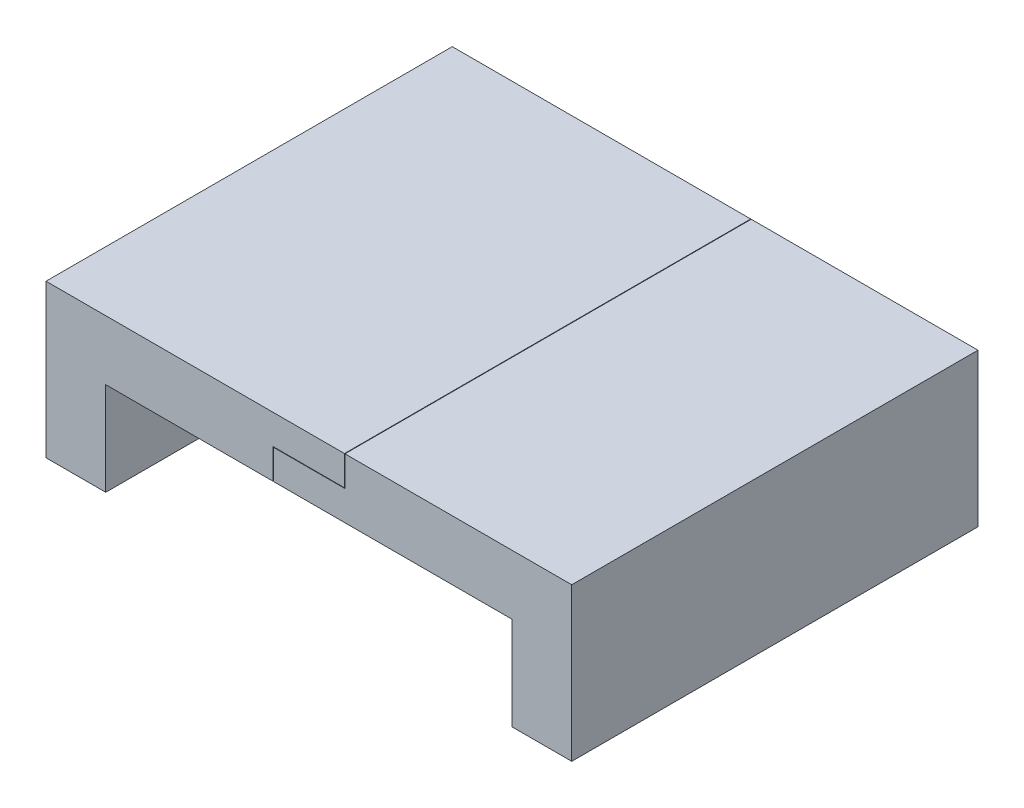
ISO-10303-21;
HEADER;
FILE_DESCRIPTION(('STEP AP214'),'2;1');
FILE_NAME('part.step','',(''),(''),'','','');
FILE_SCHEMA(('AUTOMOTIVE_DESIGN { 1 0 10303 214 1 1 1 1 }'));
ENDSEC;
DATA;
#1=APPLICATION_CONTEXT('core data for automotive mechanical design processes');
#2=APPLICATION_PROTOCOL_DEFINITION('international standard','automotive_design',2000,#1);
#3=PRODUCT_CONTEXT('',#1,'mechanical');
#4=PRODUCT('Part','Part','',(#3));
#5=PRODUCT_RELATED_PRODUCT_CATEGORY('part','',(#4));
#6=PRODUCT_DEFINITION_FORMATION('','',#4);
#7=PRODUCT_DEFINITION_CONTEXT('part definition',#1,'design');
#8=PRODUCT_DEFINITION('design','',#6,#7);
#9=PRODUCT_DEFINITION_SHAPE('','',#8);
#10=(LENGTH_UNIT() NAMED_UNIT(*) SI_UNIT(.MILLI.,.METRE.));
#11=(NAMED_UNIT(*) PLANE_ANGLE_UNIT() SI_UNIT($,.RADIAN.));
#12=(NAMED_UNIT(*) SI_UNIT($,.STERADIAN.) SOLID_ANGLE_UNIT());
#13=UNCERTAINTY_MEASURE_WITH_UNIT(LENGTH_MEASURE(1.E-05),#10,'distance_accuracy_value','');
#14=(GEOMETRIC_REPRESENTATION_CONTEXT(3) GLOBAL_UNCERTAINTY_ASSIGNED_CONTEXT((#13)) GLOBAL_UNIT_ASSIGNED_CONTEXT((#10,
#11,#12)) REPRESENTATION_CONTEXT('',''));
#15=CARTESIAN_POINT('',(0.,0.,0.));
#16=DIRECTION('',(0.,0.,1.));
#17=DIRECTION('',(1.,0.,0.));
#18=AXIS2_PLACEMENT_3D('',#15,#16,#17);
#19=CARTESIAN_POINT('',(0.,0.,0.));
#20=DIRECTION('',(0.,1.,0.));
#21=DIRECTION('',(0.,0.,1.));
#22=AXIS2_PLACEMENT_3D('',#19,#20,#21);
#23=PLANE('',#22);
#24=DIRECTION('',(-1.,0.,0.));
#25=VECTOR('',#24,1.);
#26=CARTESIAN_POINT('',(-139.7,0.,-107.95));
#27=LINE('',#26,#25);
#28=CARTESIAN_POINT('',(-19.177,0.,-107.95));
#29=VERTEX_POINT('',#28);
#30=CARTESIAN_POINT('',(-107.95,0.,-107.95));
#31=VERTEX_POINT('',#30);
#32=EDGE_CURVE('E156',#29,#31,#27,.T.);
#33=ORIENTED_EDGE('',*,*,#32,.F.);
#34=DIRECTION('',(0.,0.,1.));
#35=VECTOR('',#34,1.);
#36=CARTESIAN_POINT('',(-19.177,0.,-107.950012));
#37=LINE('',#36,#35);
#38=CARTESIAN_POINT('',(-19.177,0.,107.95));
#39=VERTEX_POINT('',#38);
#40=EDGE_CURVE('E219',#29,#39,#37,.T.);
#41=ORIENTED_EDGE('',*,*,#40,.T.);
#42=DIRECTION('',(1.,0.,0.));
#43=VECTOR('',#42,1.);
#44=CARTESIAN_POINT('',(-139.7,0.,107.95));
#45=LINE('',#44,#43);
#46=CARTESIAN_POINT('',(-107.95,0.,107.95));
#47=VERTEX_POINT('',#46);
#48=EDGE_CURVE('E138',#47,#39,#45,.T.);
#49=ORIENTED_EDGE('',*,*,#48,.F.);
#50=DIRECTION('',(0.,0.,1.));
#51=VECTOR('',#50,1.);
#52=CARTESIAN_POINT('',(-107.95,0.,-166.782672895254));
#53=LINE('',#52,#51);
#54=EDGE_CURVE('E150',#31,#47,#53,.T.);
#55=ORIENTED_EDGE('',*,*,#54,.F.);
#56=EDGE_LOOP('',(#33,#41,#49,#55));
#57=FACE_BOUND('',#56,.T.);
#58=ADVANCED_FACE('F51',(#57),#23,.F.);
#59=CARTESIAN_POINT('',(-139.7,31.75,-107.95));
#60=DIRECTION('',(0.,0.,1.));
#61=DIRECTION('',(1.,0.,0.));
#62=AXIS2_PLACEMENT_3D('',#59,#60,#61);
#63=PLANE('',#62);
#64=DIRECTION('',(-1.,0.,0.));
#65=VECTOR('',#64,1.);
#66=CARTESIAN_POINT('',(-139.7,16.002,-107.95));
#67=LINE('',#66,#65);
#68=CARTESIAN_POINT('',(18.923,16.002,-107.95));
#69=VERTEX_POINT('',#68);
#70=CARTESIAN_POINT('',(-19.177,16.002,-107.95));
#71=VERTEX_POINT('',#70);
#72=EDGE_CURVE('E216',#69,#71,#67,.T.);
#73=ORIENTED_EDGE('',*,*,#72,.T.);
#74=DIRECTION('',(0.,-1.,0.));
#75=VECTOR('',#74,1.);
#76=CARTESIAN_POINT('',(-19.177,31.75,-107.95));
#77=LINE('',#76,#75);
#78=EDGE_CURVE('E120',#71,#29,#77,.T.);
#79=ORIENTED_EDGE('',*,*,#78,.T.);
#80=ORIENTED_EDGE('',*,*,#32,.T.);
#81=DIRECTION('',(0.,-1.,0.));
#82=VECTOR('',#81,1.);
#83=CARTESIAN_POINT('',(-107.95,0.,-107.95));
#84=LINE('',#83,#82);
#85=CARTESIAN_POINT('',(-107.95,-49.53,-107.95));
#86=VERTEX_POINT('',#85);
#87=EDGE_CURVE('E159',#31,#86,#84,.T.);
#88=ORIENTED_EDGE('',*,*,#87,.T.);
#89=DIRECTION('',(-1.,0.,0.));
#90=VECTOR('',#89,1.);
#91=CARTESIAN_POINT('',(-139.7,-49.53,-107.95));
#92=LINE('',#91,#90);
#93=CARTESIAN_POINT('',(-139.7,-49.53,-107.95));
#94=VERTEX_POINT('',#93);
#95=EDGE_CURVE('E195',#86,#94,#92,.T.);
#96=ORIENTED_EDGE('',*,*,#95,.T.);
#97=DIRECTION('',(0.,-1.,0.));
#98=VECTOR('',#97,1.);
#99=CARTESIAN_POINT('',(-139.7,31.75,-107.95));
#100=LINE('',#99,#98);
#101=CARTESIAN_POINT('',(-139.7,31.75,-107.95));
#102=VERTEX_POINT('',#101);
#103=EDGE_CURVE('E186',#102,#94,#100,.T.);
#104=ORIENTED_EDGE('',*,*,#103,.F.);
#105=DIRECTION('',(-1.,0.,0.));
#106=VECTOR('',#105,1.);
#107=CARTESIAN_POINT('',(-139.7,31.75,-107.95));
#108=LINE('',#107,#106);
#109=CARTESIAN_POINT('',(18.923,31.75,-107.95));
#110=VERTEX_POINT('',#109);
#111=EDGE_CURVE('E152',#110,#102,#108,.T.);
#112=ORIENTED_EDGE('',*,*,#111,.F.);
#113=DIRECTION('',(0.,-1.,0.));
#114=VECTOR('',#113,1.);
#115=CARTESIAN_POINT('',(18.923,31.75,-107.95));
#116=LINE('',#115,#114);
#117=EDGE_CURVE('E68',#110,#69,#116,.T.);
#118=ORIENTED_EDGE('',*,*,#117,.T.);
#119=EDGE_LOOP('',(#73,#79,#80,#88,#96,#104,#112,#118));
#120=FACE_BOUND('',#119,.T.);
#121=ADVANCED_FACE('F249',(#120),#63,.F.);
#122=CARTESIAN_POINT('',(-139.7,31.75,-107.95));
#123=DIRECTION('',(1.,0.,0.));
#124=DIRECTION('',(0.,0.,-1.));
#125=AXIS2_PLACEMENT_3D('',#122,#123,#124);
#126=PLANE('',#125);
#127=ORIENTED_EDGE('',*,*,#103,.T.);
#128=DIRECTION('',(0.,0.,1.));
#129=VECTOR('',#128,1.);
#130=CARTESIAN_POINT('',(-139.7,-49.53,-166.782672895254));
#131=LINE('',#130,#129);
#132=CARTESIAN_POINT('',(-139.7,-49.53,107.95));
#133=VERTEX_POINT('',#132);
#134=EDGE_CURVE('E142',#94,#133,#131,.T.);
#135=ORIENTED_EDGE('',*,*,#134,.T.);
#136=DIRECTION('',(0.,-1.,0.));
#137=VECTOR('',#136,1.);
#138=CARTESIAN_POINT('',(-139.7,31.75,107.95));
#139=LINE('',#138,#137);
#140=CARTESIAN_POINT('',(-139.7,31.75,107.95));
#141=VERTEX_POINT('',#140);
#142=EDGE_CURVE('E189',#141,#133,#139,.T.);
#143=ORIENTED_EDGE('',*,*,#142,.F.);
#144=DIRECTION('',(0.,0.,1.));
#145=VECTOR('',#144,1.);
#146=CARTESIAN_POINT('',(-139.7,31.75,-107.95));
#147=LINE('',#146,#145);
#148=EDGE_CURVE('E151',#102,#141,#147,.T.);
#149=ORIENTED_EDGE('',*,*,#148,.F.);
#150=EDGE_LOOP('',(#127,#135,#143,#149));
#151=FACE_BOUND('',#150,.T.);
#152=ADVANCED_FACE('F234',(#151),#126,.F.);
#153=CARTESIAN_POINT('',(-139.7,31.75,107.95));
#154=DIRECTION('',(0.,0.,-1.));
#155=DIRECTION('',(-1.,0.,0.));
#156=AXIS2_PLACEMENT_3D('',#153,#154,#155);
#157=PLANE('',#156);
#158=ORIENTED_EDGE('',*,*,#48,.T.);
#159=DIRECTION('',(0.,1.,0.));
#160=VECTOR('',#159,1.);
#161=CARTESIAN_POINT('',(-19.177,15.875,107.95));
#162=LINE('',#161,#160);
#163=CARTESIAN_POINT('',(-19.177,16.002,107.95));
#164=VERTEX_POINT('',#163);
#165=EDGE_CURVE('E117',#39,#164,#162,.T.);
#166=ORIENTED_EDGE('',*,*,#165,.T.);
#167=DIRECTION('',(1.,0.,0.));
#168=VECTOR('',#167,1.);
#169=CARTESIAN_POINT('',(19.05,16.002,107.95));
#170=LINE('',#169,#168);
#171=CARTESIAN_POINT('',(18.923,16.002,107.95));
#172=VERTEX_POINT('',#171);
#173=EDGE_CURVE('E127',#164,#172,#170,.T.);
#174=ORIENTED_EDGE('',*,*,#173,.T.);
#175=DIRECTION('',(0.,1.,0.));
#176=VECTOR('',#175,1.);
#177=CARTESIAN_POINT('',(18.923,31.75,107.95));
#178=LINE('',#177,#176);
#179=CARTESIAN_POINT('',(18.923,31.75,107.95));
#180=VERTEX_POINT('',#179);
#181=EDGE_CURVE('E133',#172,#180,#178,.T.);
#182=ORIENTED_EDGE('',*,*,#181,.T.);
#183=DIRECTION('',(1.,0.,0.));
#184=VECTOR('',#183,1.);
#185=CARTESIAN_POINT('',(-139.7,31.75,107.95));
#186=LINE('',#185,#184);
#187=EDGE_CURVE('E146',#141,#180,#186,.T.);
#188=ORIENTED_EDGE('',*,*,#187,.F.);
#189=ORIENTED_EDGE('',*,*,#142,.T.);
#190=DIRECTION('',(1.,0.,0.));
#191=VECTOR('',#190,1.);
#192=CARTESIAN_POINT('',(-139.7,-49.53,107.95));
#193=LINE('',#192,#191);
#194=CARTESIAN_POINT('',(-107.95,-49.53,107.95));
#195=VERTEX_POINT('',#194);
#196=EDGE_CURVE('E192',#133,#195,#193,.T.);
#197=ORIENTED_EDGE('',*,*,#196,.T.);
#198=DIRECTION('',(0.,1.,0.));
#199=VECTOR('',#198,1.);
#200=CARTESIAN_POINT('',(-107.95,0.,107.95));
#201=LINE('',#200,#199);
#202=EDGE_CURVE('E154',#195,#47,#201,.T.);
#203=ORIENTED_EDGE('',*,*,#202,.T.);
#204=EDGE_LOOP('',(#158,#166,#174,#182,#188,#189,#197,#203));
#205=FACE_BOUND('',#204,.T.);
#206=ADVANCED_FACE('F136',(#205),#157,.F.);
#207=CARTESIAN_POINT('',(0.,31.75,0.));
#208=DIRECTION('',(0.,1.,0.));
#209=DIRECTION('',(0.,0.,1.));
#210=AXIS2_PLACEMENT_3D('',#207,#208,#209);
#211=PLANE('',#210);
#212=DIRECTION('',(0.,0.,1.));
#213=VECTOR('',#212,1.);
#214=CARTESIAN_POINT('',(18.923,31.75,0.));
#215=LINE('',#214,#213);
#216=EDGE_CURVE('E12',#110,#180,#215,.T.);
#217=ORIENTED_EDGE('',*,*,#216,.F.);
#218=ORIENTED_EDGE('',*,*,#111,.T.);
#219=ORIENTED_EDGE('',*,*,#148,.T.);
#220=ORIENTED_EDGE('',*,*,#187,.T.);
#221=EDGE_LOOP('',(#217,#218,#219,#220));
#222=FACE_BOUND('',#221,.T.);
#223=ADVANCED_FACE('F228',(#222),#211,.T.);
#224=CARTESIAN_POINT('',(-107.95,0.,-166.782672895254));
#225=DIRECTION('',(1.,0.,0.));
#226=DIRECTION('',(0.,0.,-1.));
#227=AXIS2_PLACEMENT_3D('',#224,#225,#226);
#228=PLANE('',#227);
#229=ORIENTED_EDGE('',*,*,#87,.F.);
#230=ORIENTED_EDGE('',*,*,#54,.T.);
#231=ORIENTED_EDGE('',*,*,#202,.F.);
#232=DIRECTION('',(0.,0.,1.));
#233=VECTOR('',#232,1.);
#234=CARTESIAN_POINT('',(-107.95,-49.53,-166.782672895254));
#235=LINE('',#234,#233);
#236=EDGE_CURVE('E124',#86,#195,#235,.T.);
#237=ORIENTED_EDGE('',*,*,#236,.F.);
#238=EDGE_LOOP('',(#229,#230,#231,#237));
#239=FACE_BOUND('',#238,.T.);
#240=ADVANCED_FACE('F244',(#239),#228,.T.);
#241=CARTESIAN_POINT('',(-139.7,-49.53,-166.782672895254));
#242=DIRECTION('',(0.,-1.,0.));
#243=DIRECTION('',(0.,0.,-1.));
#244=AXIS2_PLACEMENT_3D('',#241,#242,#243);
#245=PLANE('',#244);
#246=ORIENTED_EDGE('',*,*,#95,.F.);
#247=ORIENTED_EDGE('',*,*,#236,.T.);
#248=ORIENTED_EDGE('',*,*,#196,.F.);
#249=ORIENTED_EDGE('',*,*,#134,.F.);
#250=EDGE_LOOP('',(#246,#247,#248,#249));
#251=FACE_BOUND('',#250,.T.);
#252=ADVANCED_FACE('F240',(#251),#245,.T.);
#253=CARTESIAN_POINT('',(-19.177,15.875,-107.950012));
#254=DIRECTION('',(-1.,0.,0.));
#255=DIRECTION('',(0.,0.,1.));
#256=AXIS2_PLACEMENT_3D('',#253,#254,#255);
#257=PLANE('',#256);
#258=DIRECTION('',(0.,0.,1.));
#259=VECTOR('',#258,1.);
#260=CARTESIAN_POINT('',(-19.177,16.002,-107.950012));
#261=LINE('',#260,#259);
#262=EDGE_CURVE('E113',#71,#164,#261,.T.);
#263=ORIENTED_EDGE('',*,*,#262,.T.);
#264=ORIENTED_EDGE('',*,*,#165,.F.);
#265=ORIENTED_EDGE('',*,*,#40,.F.);
#266=ORIENTED_EDGE('',*,*,#78,.F.);
#267=EDGE_LOOP('',(#263,#264,#265,#266));
#268=FACE_BOUND('',#267,.T.);
#269=ADVANCED_FACE('F115',(#268),#257,.F.);
#270=CARTESIAN_POINT('',(19.05,16.002,-107.950012));
#271=DIRECTION('',(0.,1.,0.));
#272=DIRECTION('',(-1.,0.,0.));
#273=AXIS2_PLACEMENT_3D('',#270,#271,#272);
#274=PLANE('',#273);
#275=CARTESIAN_POINT('',(0.104588235294123,16.002,88.9));
#276=DIRECTION('',(0.,-1.,0.));
#277=DIRECTION('',(1.,0.,0.));
#278=AXIS2_PLACEMENT_3D('',#275,#276,#277);
#279=CIRCLE('',#278,2.032);
#280=CARTESIAN_POINT('',(2.13658823529412,16.002,88.9));
#281=VERTEX_POINT('',#280);
#282=EDGE_CURVE('E433',#281,#281,#279,.T.);
#283=ORIENTED_EDGE('',*,*,#282,.F.);
#284=EDGE_LOOP('',(#283));
#285=FACE_BOUND('',#284,.T.);
#286=CARTESIAN_POINT('',(0.,16.002,0.));
#287=DIRECTION('',(0.,-1.,0.));
#288=DIRECTION('',(1.,0.,0.));
#289=AXIS2_PLACEMENT_3D('',#286,#287,#288);
#290=CIRCLE('',#289,2.032);
#291=CARTESIAN_POINT('',(2.032,16.002,0.));
#292=VERTEX_POINT('',#291);
#293=EDGE_CURVE('E425',#292,#292,#290,.T.);
#294=ORIENTED_EDGE('',*,*,#293,.F.);
#295=EDGE_LOOP('',(#294));
#296=FACE_BOUND('',#295,.T.);
#297=CARTESIAN_POINT('',(0.104588235294146,16.002,-88.9));
#298=DIRECTION('',(0.,-1.,0.));
#299=DIRECTION('',(1.,0.,0.));
#300=AXIS2_PLACEMENT_3D('',#297,#298,#299);
#301=CIRCLE('',#300,2.032);
#302=CARTESIAN_POINT('',(2.13658823529415,16.002,-88.9));
#303=VERTEX_POINT('',#302);
#304=EDGE_CURVE('E417',#303,#303,#301,.T.);
#305=ORIENTED_EDGE('',*,*,#304,.F.);
#306=EDGE_LOOP('',(#305));
#307=FACE_BOUND('',#306,.T.);
#308=DIRECTION('',(0.,0.,1.));
#309=VECTOR('',#308,1.);
#310=CARTESIAN_POINT('',(18.923,16.002,-107.950012));
#311=LINE('',#310,#309);
#312=EDGE_CURVE('E61',#69,#172,#311,.T.);
#313=ORIENTED_EDGE('',*,*,#312,.T.);
#314=ORIENTED_EDGE('',*,*,#173,.F.);
#315=ORIENTED_EDGE('',*,*,#262,.F.);
#316=ORIENTED_EDGE('',*,*,#72,.F.);
#317=EDGE_LOOP('',(#313,#314,#315,#316));
#318=FACE_BOUND('',#317,.T.);
#319=ADVANCED_FACE('F128',(#285,#296,#307,#318),#274,.F.);
#320=CARTESIAN_POINT('',(18.923,31.75,-107.950012));
#321=DIRECTION('',(-1.,0.,0.));
#322=DIRECTION('',(0.,0.,1.));
#323=AXIS2_PLACEMENT_3D('',#320,#321,#322);
#324=PLANE('',#323);
#325=ORIENTED_EDGE('',*,*,#216,.T.);
#326=ORIENTED_EDGE('',*,*,#181,.F.);
#327=ORIENTED_EDGE('',*,*,#312,.F.);
#328=ORIENTED_EDGE('',*,*,#117,.F.);
#329=EDGE_LOOP('',(#325,#326,#327,#328));
#330=FACE_BOUND('',#329,.T.);
#331=ADVANCED_FACE('F250',(#330),#324,.F.);
#332=CARTESIAN_POINT('',(0.104588235294122,22.002,88.9));
#333=DIRECTION('',(0.,-1.,0.));
#334=DIRECTION('',(1.,0.,0.));
#335=AXIS2_PLACEMENT_3D('',#332,#333,#334);
#336=PLANE('',#335);
#337=CARTESIAN_POINT('',(0.104588235294122,22.002,88.9));
#338=DIRECTION('',(0.,-1.,0.));
#339=DIRECTION('',(1.,0.,0.));
#340=AXIS2_PLACEMENT_3D('',#337,#338,#339);
#341=CIRCLE('',#340,2.032);
#342=CARTESIAN_POINT('',(2.13658823529412,22.002,88.9));
#343=VERTEX_POINT('',#342);
#344=EDGE_CURVE('E164',#343,#343,#341,.T.);
#345=ORIENTED_EDGE('',*,*,#344,.T.);
#346=EDGE_LOOP('',(#345));
#347=FACE_BOUND('',#346,.T.);
#348=CARTESIAN_POINT('',(0.104588235294122,22.002,88.9));
#349=DIRECTION('',(0.,-1.,0.));
#350=DIRECTION('',(1.,0.,0.));
#351=AXIS2_PLACEMENT_3D('',#348,#349,#350);
#352=CIRCLE('',#351,1.7);
#353=CARTESIAN_POINT('',(1.80458823529412,22.002,88.9));
#354=VERTEX_POINT('',#353);
#355=EDGE_CURVE('E160',#354,#354,#352,.F.);
#356=ORIENTED_EDGE('',*,*,#355,.T.);
#357=EDGE_LOOP('',(#356));
#358=FACE_BOUND('',#357,.T.);
#359=ADVANCED_FACE('F252',(#347,#358),#336,.T.);
#360=CARTESIAN_POINT('',(0.104588235294122,22.002,88.9));
#361=DIRECTION('',(0.,-1.,0.));
#362=DIRECTION('',(1.,0.,0.));
#363=AXIS2_PLACEMENT_3D('',#360,#361,#362);
#364=CYLINDRICAL_SURFACE('',#363,2.032);
#365=ORIENTED_EDGE('',*,*,#344,.F.);
#366=EDGE_LOOP('',(#365));
#367=FACE_BOUND('',#366,.T.);
#368=ORIENTED_EDGE('',*,*,#282,.T.);
#369=EDGE_LOOP('',(#368));
#370=FACE_BOUND('',#369,.T.);
#371=ADVANCED_FACE('F258',(#367,#370),#364,.F.);
#372=CARTESIAN_POINT('',(0.,22.002,0.));
#373=DIRECTION('',(0.,-1.,0.));
#374=DIRECTION('',(1.,0.,0.));
#375=AXIS2_PLACEMENT_3D('',#372,#373,#374);
#376=PLANE('',#375);
#377=CARTESIAN_POINT('',(0.,22.002,0.));
#378=DIRECTION('',(0.,-1.,0.));
#379=DIRECTION('',(1.,0.,0.));
#380=AXIS2_PLACEMENT_3D('',#377,#378,#379);
#381=CIRCLE('',#380,2.032);
#382=CARTESIAN_POINT('',(2.032,22.002,0.));
#383=VERTEX_POINT('',#382);
#384=EDGE_CURVE('E429',#383,#383,#381,.T.);
#385=ORIENTED_EDGE('',*,*,#384,.T.);
#386=EDGE_LOOP('',(#385));
#387=FACE_BOUND('',#386,.T.);
#388=CARTESIAN_POINT('',(0.,22.002,0.));
#389=DIRECTION('',(0.,-1.,0.));
#390=DIRECTION('',(1.,0.,0.));
#391=AXIS2_PLACEMENT_3D('',#388,#389,#390);
#392=CIRCLE('',#391,1.7);
#393=CARTESIAN_POINT('',(1.7,22.002,0.));
#394=VERTEX_POINT('',#393);
#395=EDGE_CURVE('E163',#394,#394,#392,.F.);
#396=ORIENTED_EDGE('',*,*,#395,.T.);
#397=EDGE_LOOP('',(#396));
#398=FACE_BOUND('',#397,.T.);
#399=ADVANCED_FACE('F316',(#387,#398),#376,.T.);
#400=CARTESIAN_POINT('',(0.,22.002,0.));
#401=DIRECTION('',(0.,-1.,0.));
#402=DIRECTION('',(1.,0.,0.));
#403=AXIS2_PLACEMENT_3D('',#400,#401,#402);
#404=CYLINDRICAL_SURFACE('',#403,2.032);
#405=ORIENTED_EDGE('',*,*,#384,.F.);
#406=EDGE_LOOP('',(#405));
#407=FACE_BOUND('',#406,.T.);
#408=ORIENTED_EDGE('',*,*,#293,.T.);
#409=EDGE_LOOP('',(#408));
#410=FACE_BOUND('',#409,.T.);
#411=ADVANCED_FACE('F326',(#407,#410),#404,.F.);
#412=CARTESIAN_POINT('',(0.104588235294145,22.002,-88.9));
#413=DIRECTION('',(0.,-1.,0.));
#414=DIRECTION('',(1.,0.,0.));
#415=AXIS2_PLACEMENT_3D('',#412,#413,#414);
#416=PLANE('',#415);
#417=CARTESIAN_POINT('',(0.104588235294145,22.002,-88.9));
#418=DIRECTION('',(0.,-1.,0.));
#419=DIRECTION('',(1.,0.,0.));
#420=AXIS2_PLACEMENT_3D('',#417,#418,#419);
#421=CIRCLE('',#420,2.032);
#422=CARTESIAN_POINT('',(2.13658823529415,22.002,-88.9));
#423=VERTEX_POINT('',#422);
#424=EDGE_CURVE('E421',#423,#423,#421,.T.);
#425=ORIENTED_EDGE('',*,*,#424,.T.);
#426=EDGE_LOOP('',(#425));
#427=FACE_BOUND('',#426,.T.);
#428=CARTESIAN_POINT('',(0.104588235294145,22.002,-88.9));
#429=DIRECTION('',(0.,-1.,0.));
#430=DIRECTION('',(1.,0.,0.));
#431=AXIS2_PLACEMENT_3D('',#428,#429,#430);
#432=CIRCLE('',#431,1.7);
#433=CARTESIAN_POINT('',(1.80458823529414,22.002,-88.9));
#434=VERTEX_POINT('',#433);
#435=EDGE_CURVE('E54',#434,#434,#432,.F.);
#436=ORIENTED_EDGE('',*,*,#435,.T.);
#437=EDGE_LOOP('',(#436));
#438=FACE_BOUND('',#437,.T.);
#439=ADVANCED_FACE('F336',(#427,#438),#416,.T.);
#440=CARTESIAN_POINT('',(0.104588235294145,22.002,-88.9));
#441=DIRECTION('',(0.,-1.,0.));
#442=DIRECTION('',(1.,0.,0.));
#443=AXIS2_PLACEMENT_3D('',#440,#441,#442);
#444=CYLINDRICAL_SURFACE('',#443,2.032);
#445=ORIENTED_EDGE('',*,*,#424,.F.);
#446=EDGE_LOOP('',(#445));
#447=FACE_BOUND('',#446,.T.);
#448=ORIENTED_EDGE('',*,*,#304,.T.);
#449=EDGE_LOOP('',(#448));
#450=FACE_BOUND('',#449,.T.);
#451=ADVANCED_FACE('F346',(#447,#450),#444,.F.);
#452=CARTESIAN_POINT('',(0.104588235294122,24.098,88.9));
#453=DIRECTION('',(0.,-1.,0.));
#454=DIRECTION('',(0.,0.,-1.));
#455=AXIS2_PLACEMENT_3D('',#452,#453,#454);
#456=PLANE('',#455);
#457=CARTESIAN_POINT('',(0.104588235294122,24.098,88.9));
#458=DIRECTION('',(0.,-1.,0.));
#459=DIRECTION('',(0.,0.,-1.));
#460=AXIS2_PLACEMENT_3D('',#457,#458,#459);
#461=CIRCLE('',#460,1.7);
#462=CARTESIAN_POINT('',(0.104588235294122,24.098,87.2));
#463=VERTEX_POINT('',#462);
#464=EDGE_CURVE('E182',#463,#463,#461,.T.);
#465=ORIENTED_EDGE('',*,*,#464,.T.);
#466=EDGE_LOOP('',(#465));
#467=FACE_BOUND('',#466,.T.);
#468=ADVANCED_FACE('F300',(#467),#456,.T.);
#469=CARTESIAN_POINT('',(0.104588235294122,24.098,88.9));
#470=DIRECTION('',(0.,-1.,0.));
#471=DIRECTION('',(0.,0.,-1.));
#472=AXIS2_PLACEMENT_3D('',#469,#470,#471);
#473=CYLINDRICAL_SURFACE('',#472,1.7);
#474=ORIENTED_EDGE('',*,*,#464,.F.);
#475=EDGE_LOOP('',(#474));
#476=FACE_BOUND('',#475,.T.);
#477=ORIENTED_EDGE('',*,*,#355,.F.);
#478=EDGE_LOOP('',(#477));
#479=FACE_BOUND('',#478,.T.);
#480=ADVANCED_FACE('F361',(#476,#479),#473,.F.);
#481=CARTESIAN_POINT('',(0.,24.098,0.));
#482=DIRECTION('',(0.,-1.,0.));
#483=DIRECTION('',(0.,0.,-1.));
#484=AXIS2_PLACEMENT_3D('',#481,#482,#483);
#485=PLANE('',#484);
#486=CARTESIAN_POINT('',(0.,24.098,0.));
#487=DIRECTION('',(0.,-1.,0.));
#488=DIRECTION('',(0.,0.,-1.));
#489=AXIS2_PLACEMENT_3D('',#486,#487,#488);
#490=CIRCLE('',#489,1.7);
#491=CARTESIAN_POINT('',(0.,24.098,-1.7));
#492=VERTEX_POINT('',#491);
#493=EDGE_CURVE('E176',#492,#492,#490,.T.);
#494=ORIENTED_EDGE('',*,*,#493,.T.);
#495=EDGE_LOOP('',(#494));
#496=FACE_BOUND('',#495,.T.);
#497=ADVANCED_FACE('F366',(#496),#485,.T.);
#498=CARTESIAN_POINT('',(0.,24.098,0.));
#499=DIRECTION('',(0.,-1.,0.));
#500=DIRECTION('',(0.,0.,-1.));
#501=AXIS2_PLACEMENT_3D('',#498,#499,#500);
#502=CYLINDRICAL_SURFACE('',#501,1.7);
#503=ORIENTED_EDGE('',*,*,#493,.F.);
#504=EDGE_LOOP('',(#503));
#505=FACE_BOUND('',#504,.T.);
#506=ORIENTED_EDGE('',*,*,#395,.F.);
#507=EDGE_LOOP('',(#506));
#508=FACE_BOUND('',#507,.T.);
#509=ADVANCED_FACE('F374',(#505,#508),#502,.F.);
#510=CARTESIAN_POINT('',(0.104588235294145,24.098,-88.9));
#511=DIRECTION('',(0.,-1.,0.));
#512=DIRECTION('',(0.,0.,-1.));
#513=AXIS2_PLACEMENT_3D('',#510,#511,#512);
#514=PLANE('',#513);
#515=CARTESIAN_POINT('',(0.104588235294145,24.098,-88.9));
#516=DIRECTION('',(0.,-1.,0.));
#517=DIRECTION('',(0.,0.,-1.));
#518=AXIS2_PLACEMENT_3D('',#515,#516,#517);
#519=CIRCLE('',#518,1.7);
#520=CARTESIAN_POINT('',(0.104588235294145,24.098,-90.6));
#521=VERTEX_POINT('',#520);
#522=EDGE_CURVE('E171',#521,#521,#519,.T.);
#523=ORIENTED_EDGE('',*,*,#522,.T.);
#524=EDGE_LOOP('',(#523));
#525=FACE_BOUND('',#524,.T.);
#526=ADVANCED_FACE('F378',(#525),#514,.T.);
#527=CARTESIAN_POINT('',(0.104588235294145,24.098,-88.9));
#528=DIRECTION('',(0.,-1.,0.));
#529=DIRECTION('',(0.,0.,-1.));
#530=AXIS2_PLACEMENT_3D('',#527,#528,#529);
#531=CYLINDRICAL_SURFACE('',#530,1.7);
#532=ORIENTED_EDGE('',*,*,#522,.F.);
#533=EDGE_LOOP('',(#532));
#534=FACE_BOUND('',#533,.T.);
#535=ORIENTED_EDGE('',*,*,#435,.F.);
#536=EDGE_LOOP('',(#535));
#537=FACE_BOUND('',#536,.T.);
#538=ADVANCED_FACE('F385',(#534,#537),#531,.F.);
#539=CLOSED_SHELL('',(#58,#121,#152,#206,#223,#240,#252,#269,#319,#331,#359,#371,#399,#411,#439,
#451,#468,#480,#497,#509,#526,#538));
#540=MANIFOLD_SOLID_BREP('B2',#539);
#541=CARTESIAN_POINT('',(139.7,-49.53,-166.782672895254));
#542=DIRECTION('',(0.,-1.,0.));
#543=DIRECTION('',(0.,0.,-1.));
#544=AXIS2_PLACEMENT_3D('',#541,#542,#543);
#545=PLANE('',#544);
#546=DIRECTION('',(-1.,0.,0.));
#547=VECTOR('',#546,1.);
#548=CARTESIAN_POINT('',(139.7,-49.53,-107.95));
#549=LINE('',#548,#547);
#550=CARTESIAN_POINT('',(139.7,-49.53,-107.95));
#551=VERTEX_POINT('',#550);
#552=CARTESIAN_POINT('',(107.95,-49.53,-107.95));
#553=VERTEX_POINT('',#552);
#554=EDGE_CURVE('E609',#551,#553,#549,.T.);
#555=ORIENTED_EDGE('',*,*,#554,.F.);
#556=DIRECTION('',(0.,0.,1.));
#557=VECTOR('',#556,1.);
#558=CARTESIAN_POINT('',(139.7,-49.53,-166.782672895254));
#559=LINE('',#558,#557);
#560=CARTESIAN_POINT('',(139.7,-49.53,107.95));
#561=VERTEX_POINT('',#560);
#562=EDGE_CURVE('E655',#551,#561,#559,.T.);
#563=ORIENTED_EDGE('',*,*,#562,.T.);
#564=DIRECTION('',(1.,0.,0.));
#565=VECTOR('',#564,1.);
#566=CARTESIAN_POINT('',(139.7,-49.53,107.95));
#567=LINE('',#566,#565);
#568=CARTESIAN_POINT('',(107.95,-49.53,107.95));
#569=VERTEX_POINT('',#568);
#570=EDGE_CURVE('E658',#569,#561,#567,.T.);
#571=ORIENTED_EDGE('',*,*,#570,.F.);
#572=DIRECTION('',(0.,0.,1.));
#573=VECTOR('',#572,1.);
#574=CARTESIAN_POINT('',(107.95,-49.53,-166.782672895254));
#575=LINE('',#574,#573);
#576=EDGE_CURVE('E663',#553,#569,#575,.T.);
#577=ORIENTED_EDGE('',*,*,#576,.F.);
#578=EDGE_LOOP('',(#555,#563,#571,#577));
#579=FACE_BOUND('',#578,.T.);
#580=ADVANCED_FACE('F509',(#579),#545,.T.);
#581=CARTESIAN_POINT('',(107.95,0.,-166.782672895254));
#582=DIRECTION('',(-1.,0.,0.));
#583=DIRECTION('',(0.,0.,1.));
#584=AXIS2_PLACEMENT_3D('',#581,#582,#583);
#585=PLANE('',#584);
#586=DIRECTION('',(0.,1.,0.));
#587=VECTOR('',#586,1.);
#588=CARTESIAN_POINT('',(107.95,0.,-107.95));
#589=LINE('',#588,#587);
#590=CARTESIAN_POINT('',(107.95,0.,-107.95));
#591=VERTEX_POINT('',#590);
#592=EDGE_CURVE('E653',#553,#591,#589,.T.);
#593=ORIENTED_EDGE('',*,*,#592,.F.);
#594=ORIENTED_EDGE('',*,*,#576,.T.);
#595=DIRECTION('',(0.,-1.,0.));
#596=VECTOR('',#595,1.);
#597=CARTESIAN_POINT('',(107.95,0.,107.95));
#598=LINE('',#597,#596);
#599=CARTESIAN_POINT('',(107.95,0.,107.95));
#600=VERTEX_POINT('',#599);
#601=EDGE_CURVE('E652',#600,#569,#598,.T.);
#602=ORIENTED_EDGE('',*,*,#601,.F.);
#603=DIRECTION('',(0.,0.,1.));
#604=VECTOR('',#603,1.);
#605=CARTESIAN_POINT('',(107.95,0.,-166.782672895254));
#606=LINE('',#605,#604);
#607=EDGE_CURVE('E603',#591,#600,#606,.T.);
#608=ORIENTED_EDGE('',*,*,#607,.F.);
#609=EDGE_LOOP('',(#593,#594,#602,#608));
#610=FACE_BOUND('',#609,.T.);
#611=ADVANCED_FACE('F686',(#610),#585,.T.);
#612=CARTESIAN_POINT('',(139.7,31.75,-107.95));
#613=DIRECTION('',(-1.,0.,0.));
#614=DIRECTION('',(0.,0.,1.));
#615=AXIS2_PLACEMENT_3D('',#612,#613,#614);
#616=PLANE('',#615);
#617=DIRECTION('',(0.,-1.,0.));
#618=VECTOR('',#617,1.);
#619=CARTESIAN_POINT('',(139.7,31.75,107.95));
#620=LINE('',#619,#618);
#621=CARTESIAN_POINT('',(139.7,31.75,107.95));
#622=VERTEX_POINT('',#621);
#623=EDGE_CURVE('E613',#622,#561,#620,.T.);
#624=ORIENTED_EDGE('',*,*,#623,.T.);
#625=ORIENTED_EDGE('',*,*,#562,.F.);
#626=DIRECTION('',(0.,-1.,0.));
#627=VECTOR('',#626,1.);
#628=CARTESIAN_POINT('',(139.7,31.75,-107.95));
#629=LINE('',#628,#627);
#630=CARTESIAN_POINT('',(139.7,31.75,-107.95));
#631=VERTEX_POINT('',#630);
#632=EDGE_CURVE('E518',#631,#551,#629,.T.);
#633=ORIENTED_EDGE('',*,*,#632,.F.);
#634=DIRECTION('',(0.,0.,-1.));
#635=VECTOR('',#634,1.);
#636=CARTESIAN_POINT('',(139.7,31.75,-107.95));
#637=LINE('',#636,#635);
#638=EDGE_CURVE('E604',#622,#631,#637,.T.);
#639=ORIENTED_EDGE('',*,*,#638,.F.);
#640=EDGE_LOOP('',(#624,#625,#633,#639));
#641=FACE_BOUND('',#640,.T.);
#642=ADVANCED_FACE('F511',(#641),#616,.F.);
#643=CARTESIAN_POINT('',(0.,31.75,0.));
#644=DIRECTION('',(0.,1.,0.));
#645=DIRECTION('',(0.,0.,1.));
#646=AXIS2_PLACEMENT_3D('',#643,#644,#645);
#647=PLANE('',#646);
#648=DIRECTION('',(-1.,0.,0.));
#649=VECTOR('',#648,1.);
#650=CARTESIAN_POINT('',(-139.7,31.75,-107.95));
#651=LINE('',#650,#649);
#652=CARTESIAN_POINT('',(19.177,31.75,-107.95));
#653=VERTEX_POINT('',#652);
#654=EDGE_CURVE('E607',#631,#653,#651,.T.);
#655=ORIENTED_EDGE('',*,*,#654,.T.);
#656=DIRECTION('',(0.,0.,1.));
#657=VECTOR('',#656,1.);
#658=CARTESIAN_POINT('',(19.177,31.75,0.));
#659=LINE('',#658,#657);
#660=CARTESIAN_POINT('',(19.177,31.75,107.95));
#661=VERTEX_POINT('',#660);
#662=EDGE_CURVE('E49',#653,#661,#659,.T.);
#663=ORIENTED_EDGE('',*,*,#662,.T.);
#664=DIRECTION('',(1.,0.,0.));
#665=VECTOR('',#664,1.);
#666=CARTESIAN_POINT('',(-139.7,31.75,107.95));
#667=LINE('',#666,#665);
#668=EDGE_CURVE('E532',#661,#622,#667,.T.);
#669=ORIENTED_EDGE('',*,*,#668,.T.);
#670=ORIENTED_EDGE('',*,*,#638,.T.);
#671=EDGE_LOOP('',(#655,#663,#669,#670));
#672=FACE_BOUND('',#671,.T.);
#673=ADVANCED_FACE('F667',(#672),#647,.T.);
#674=CARTESIAN_POINT('',(-139.7,31.75,107.95));
#675=DIRECTION('',(0.,0.,-1.));
#676=DIRECTION('',(-1.,0.,0.));
#677=AXIS2_PLACEMENT_3D('',#674,#675,#676);
#678=PLANE('',#677);
#679=DIRECTION('',(0.,1.,0.));
#680=VECTOR('',#679,1.);
#681=CARTESIAN_POINT('',(-18.923,15.875,107.95));
#682=LINE('',#681,#680);
#683=CARTESIAN_POINT('',(-18.923,0.,107.95));
#684=VERTEX_POINT('',#683);
#685=CARTESIAN_POINT('',(-18.923,15.748,107.95));
#686=VERTEX_POINT('',#685);
#687=EDGE_CURVE('E580',#684,#686,#682,.T.);
#688=ORIENTED_EDGE('',*,*,#687,.F.);
#689=DIRECTION('',(1.,0.,0.));
#690=VECTOR('',#689,1.);
#691=CARTESIAN_POINT('',(-139.7,0.,107.95));
#692=LINE('',#691,#690);
#693=EDGE_CURVE('E594',#684,#600,#692,.T.);
#694=ORIENTED_EDGE('',*,*,#693,.T.);
#695=ORIENTED_EDGE('',*,*,#601,.T.);
#696=ORIENTED_EDGE('',*,*,#570,.T.);
#697=ORIENTED_EDGE('',*,*,#623,.F.);
#698=ORIENTED_EDGE('',*,*,#668,.F.);
#699=DIRECTION('',(0.,1.,0.));
#700=VECTOR('',#699,1.);
#701=CARTESIAN_POINT('',(19.177,31.75,107.95));
#702=LINE('',#701,#700);
#703=CARTESIAN_POINT('',(19.177,15.748,107.95));
#704=VERTEX_POINT('',#703);
#705=EDGE_CURVE('E526',#704,#661,#702,.T.);
#706=ORIENTED_EDGE('',*,*,#705,.F.);
#707=DIRECTION('',(1.,0.,0.));
#708=VECTOR('',#707,1.);
#709=CARTESIAN_POINT('',(19.05,15.748,107.95));
#710=LINE('',#709,#708);
#711=EDGE_CURVE('E597',#686,#704,#710,.T.);
#712=ORIENTED_EDGE('',*,*,#711,.F.);
#713=EDGE_LOOP('',(#688,#694,#695,#696,#697,#698,#706,#712));
#714=FACE_BOUND('',#713,.T.);
#715=ADVANCED_FACE('F592',(#714),#678,.F.);
#716=CARTESIAN_POINT('',(-139.7,31.75,-107.95));
#717=DIRECTION('',(0.,0.,1.));
#718=DIRECTION('',(1.,0.,0.));
#719=AXIS2_PLACEMENT_3D('',#716,#717,#718);
#720=PLANE('',#719);
#721=DIRECTION('',(0.,-1.,0.));
#722=VECTOR('',#721,1.);
#723=CARTESIAN_POINT('',(-18.923,31.75,-107.95));
#724=LINE('',#723,#722);
#725=CARTESIAN_POINT('',(-18.923,15.748,-107.95));
#726=VERTEX_POINT('',#725);
#727=CARTESIAN_POINT('',(-18.923,0.,-107.95));
#728=VERTEX_POINT('',#727);
#729=EDGE_CURVE('E583',#726,#728,#724,.T.);
#730=ORIENTED_EDGE('',*,*,#729,.F.);
#731=DIRECTION('',(-1.,0.,0.));
#732=VECTOR('',#731,1.);
#733=CARTESIAN_POINT('',(-139.7,15.748,-107.95));
#734=LINE('',#733,#732);
#735=CARTESIAN_POINT('',(19.177,15.748,-107.95));
#736=VERTEX_POINT('',#735);
#737=EDGE_CURVE('E649',#736,#726,#734,.T.);
#738=ORIENTED_EDGE('',*,*,#737,.F.);
#739=DIRECTION('',(0.,-1.,0.));
#740=VECTOR('',#739,1.);
#741=CARTESIAN_POINT('',(19.177,31.75,-107.95));
#742=LINE('',#741,#740);
#743=EDGE_CURVE('E588',#653,#736,#742,.T.);
#744=ORIENTED_EDGE('',*,*,#743,.F.);
#745=ORIENTED_EDGE('',*,*,#654,.F.);
#746=ORIENTED_EDGE('',*,*,#632,.T.);
#747=ORIENTED_EDGE('',*,*,#554,.T.);
#748=ORIENTED_EDGE('',*,*,#592,.T.);
#749=DIRECTION('',(-1.,0.,0.));
#750=VECTOR('',#749,1.);
#751=CARTESIAN_POINT('',(-139.7,0.,-107.95));
#752=LINE('',#751,#750);
#753=EDGE_CURVE('E605',#591,#728,#752,.T.);
#754=ORIENTED_EDGE('',*,*,#753,.T.);
#755=EDGE_LOOP('',(#730,#738,#744,#745,#746,#747,#748,#754));
#756=FACE_BOUND('',#755,.T.);
#757=ADVANCED_FACE('F672',(#756),#720,.F.);
#758=CARTESIAN_POINT('',(0.,0.,0.));
#759=DIRECTION('',(0.,1.,0.));
#760=DIRECTION('',(0.,0.,1.));
#761=AXIS2_PLACEMENT_3D('',#758,#759,#760);
#762=PLANE('',#761);
#763=CARTESIAN_POINT('',(0.104588235294145,0.,-88.9));
#764=DIRECTION('',(0.,-1.,0.));
#765=DIRECTION('',(0.,0.,-1.));
#766=AXIS2_PLACEMENT_3D('',#763,#764,#765);
#767=CIRCLE('',#766,3.);
#768=CARTESIAN_POINT('',(0.104588235294145,0.,-91.9));
#769=VERTEX_POINT('',#768);
#770=EDGE_CURVE('E624',#769,#769,#767,.T.);
#771=ORIENTED_EDGE('',*,*,#770,.F.);
#772=EDGE_LOOP('',(#771));
#773=FACE_BOUND('',#772,.T.);
#774=CARTESIAN_POINT('',(0.104588235294122,0.,88.9));
#775=DIRECTION('',(0.,-1.,0.));
#776=DIRECTION('',(0.,0.,-1.));
#777=AXIS2_PLACEMENT_3D('',#774,#775,#776);
#778=CIRCLE('',#777,3.);
#779=CARTESIAN_POINT('',(0.104588235294122,0.,85.9));
#780=VERTEX_POINT('',#779);
#781=EDGE_CURVE('E633',#780,#780,#778,.T.);
#782=ORIENTED_EDGE('',*,*,#781,.F.);
#783=EDGE_LOOP('',(#782));
#784=FACE_BOUND('',#783,.T.);
#785=CARTESIAN_POINT('',(0.,0.,0.));
#786=DIRECTION('',(0.,-1.,0.));
#787=DIRECTION('',(0.,0.,-1.));
#788=AXIS2_PLACEMENT_3D('',#785,#786,#787);
#789=CIRCLE('',#788,3.);
#790=CARTESIAN_POINT('',(0.,0.,-3.));
#791=VERTEX_POINT('',#790);
#792=EDGE_CURVE('E640',#791,#791,#789,.T.);
#793=ORIENTED_EDGE('',*,*,#792,.F.);
#794=EDGE_LOOP('',(#793));
#795=FACE_BOUND('',#794,.T.);
#796=DIRECTION('',(0.,0.,1.));
#797=VECTOR('',#796,1.);
#798=CARTESIAN_POINT('',(-18.923,0.,-107.950012));
#799=LINE('',#798,#797);
#800=EDGE_CURVE('E576',#728,#684,#799,.T.);
#801=ORIENTED_EDGE('',*,*,#800,.F.);
#802=ORIENTED_EDGE('',*,*,#753,.F.);
#803=ORIENTED_EDGE('',*,*,#607,.T.);
#804=ORIENTED_EDGE('',*,*,#693,.F.);
#805=EDGE_LOOP('',(#801,#802,#803,#804));
#806=FACE_BOUND('',#805,.T.);
#807=ADVANCED_FACE('F601',(#773,#784,#795,#806),#762,.F.);
#808=CARTESIAN_POINT('',(19.177,31.75,-107.950012));
#809=DIRECTION('',(-1.,0.,0.));
#810=DIRECTION('',(0.,0.,1.));
#811=AXIS2_PLACEMENT_3D('',#808,#809,#810);
#812=PLANE('',#811);
#813=ORIENTED_EDGE('',*,*,#743,.T.);
#814=DIRECTION('',(0.,0.,1.));
#815=VECTOR('',#814,1.);
#816=CARTESIAN_POINT('',(19.177,15.748,-107.950012));
#817=LINE('',#816,#815);
#818=EDGE_CURVE('E589',#736,#704,#817,.T.);
#819=ORIENTED_EDGE('',*,*,#818,.T.);
#820=ORIENTED_EDGE('',*,*,#705,.T.);
#821=ORIENTED_EDGE('',*,*,#662,.F.);
#822=EDGE_LOOP('',(#813,#819,#820,#821));
#823=FACE_BOUND('',#822,.T.);
#824=ADVANCED_FACE('F676',(#823),#812,.T.);
#825=CARTESIAN_POINT('',(19.05,15.748,-107.950012));
#826=DIRECTION('',(0.,1.,0.));
#827=DIRECTION('',(-1.,0.,0.));
#828=AXIS2_PLACEMENT_3D('',#825,#826,#827);
#829=PLANE('',#828);
#830=CARTESIAN_POINT('',(0.104588235294122,15.748,88.9));
#831=DIRECTION('',(0.,1.,0.));
#832=DIRECTION('',(-1.,0.,0.));
#833=AXIS2_PLACEMENT_3D('',#830,#831,#832);
#834=CIRCLE('',#833,1.7);
#835=CARTESIAN_POINT('',(-1.59541176470588,15.748,88.9));
#836=VERTEX_POINT('',#835);
#837=EDGE_CURVE('E513',#836,#836,#834,.T.);
#838=ORIENTED_EDGE('',*,*,#837,.F.);
#839=EDGE_LOOP('',(#838));
#840=FACE_BOUND('',#839,.T.);
#841=CARTESIAN_POINT('',(0.,15.748,0.));
#842=DIRECTION('',(0.,1.,0.));
#843=DIRECTION('',(-1.,0.,0.));
#844=AXIS2_PLACEMENT_3D('',#841,#842,#843);
#845=CIRCLE('',#844,1.7);
#846=CARTESIAN_POINT('',(-1.7,15.748,0.));
#847=VERTEX_POINT('',#846);
#848=EDGE_CURVE('E618',#847,#847,#845,.T.);
#849=ORIENTED_EDGE('',*,*,#848,.F.);
#850=EDGE_LOOP('',(#849));
#851=FACE_BOUND('',#850,.T.);
#852=CARTESIAN_POINT('',(0.104588235294145,15.748,-88.9));
#853=DIRECTION('',(0.,1.,0.));
#854=DIRECTION('',(-1.,0.,0.));
#855=AXIS2_PLACEMENT_3D('',#852,#853,#854);
#856=CIRCLE('',#855,1.7);
#857=CARTESIAN_POINT('',(-1.59541176470585,15.748,-88.9));
#858=VERTEX_POINT('',#857);
#859=EDGE_CURVE('E616',#858,#858,#856,.T.);
#860=ORIENTED_EDGE('',*,*,#859,.F.);
#861=EDGE_LOOP('',(#860));
#862=FACE_BOUND('',#861,.T.);
#863=ORIENTED_EDGE('',*,*,#737,.T.);
#864=DIRECTION('',(0.,0.,1.));
#865=VECTOR('',#864,1.);
#866=CARTESIAN_POINT('',(-18.923,15.748,-107.950012));
#867=LINE('',#866,#865);
#868=EDGE_CURVE('E598',#726,#686,#867,.T.);
#869=ORIENTED_EDGE('',*,*,#868,.T.);
#870=ORIENTED_EDGE('',*,*,#711,.T.);
#871=ORIENTED_EDGE('',*,*,#818,.F.);
#872=EDGE_LOOP('',(#863,#869,#870,#871));
#873=FACE_BOUND('',#872,.T.);
#874=ADVANCED_FACE('F678',(#840,#851,#862,#873),#829,.T.);
#875=CARTESIAN_POINT('',(-18.923,15.875,-107.950012));
#876=DIRECTION('',(-1.,0.,0.));
#877=DIRECTION('',(0.,0.,1.));
#878=AXIS2_PLACEMENT_3D('',#875,#876,#877);
#879=PLANE('',#878);
#880=ORIENTED_EDGE('',*,*,#729,.T.);
#881=ORIENTED_EDGE('',*,*,#800,.T.);
#882=ORIENTED_EDGE('',*,*,#687,.T.);
#883=ORIENTED_EDGE('',*,*,#868,.F.);
#884=EDGE_LOOP('',(#880,#881,#882,#883));
#885=FACE_BOUND('',#884,.T.);
#886=ADVANCED_FACE('F578',(#885),#879,.T.);
#887=CARTESIAN_POINT('',(0.,2.,0.));
#888=DIRECTION('',(0.,-1.,0.));
#889=DIRECTION('',(0.,0.,-1.));
#890=AXIS2_PLACEMENT_3D('',#887,#888,#889);
#891=CYLINDRICAL_SURFACE('',#890,3.);
#892=CARTESIAN_POINT('',(0.,2.,0.));
#893=DIRECTION('',(0.,-1.,0.));
#894=DIRECTION('',(0.,0.,-1.));
#895=AXIS2_PLACEMENT_3D('',#892,#893,#894);
#896=CIRCLE('',#895,3.);
#897=CARTESIAN_POINT('',(0.,2.,-3.));
#898=VERTEX_POINT('',#897);
#899=EDGE_CURVE('E637',#898,#898,#896,.T.);
#900=ORIENTED_EDGE('',*,*,#899,.F.);
#901=EDGE_LOOP('',(#900));
#902=FACE_BOUND('',#901,.T.);
#903=ORIENTED_EDGE('',*,*,#792,.T.);
#904=EDGE_LOOP('',(#903));
#905=FACE_BOUND('',#904,.T.);
#906=ADVANCED_FACE('F733',(#902,#905),#891,.F.);
#907=CARTESIAN_POINT('',(0.,2.,0.));
#908=DIRECTION('',(0.,-1.,0.));
#909=DIRECTION('',(0.,0.,-1.));
#910=AXIS2_PLACEMENT_3D('',#907,#908,#909);
#911=PLANE('',#910);
#912=CARTESIAN_POINT('',(0.,2.,0.));
#913=DIRECTION('',(0.,-1.,0.));
#914=DIRECTION('',(0.,0.,-1.));
#915=AXIS2_PLACEMENT_3D('',#912,#913,#914);
#916=CIRCLE('',#915,1.7);
#917=CARTESIAN_POINT('',(0.,2.,-1.7));
#918=VERTEX_POINT('',#917);
#919=EDGE_CURVE('E873',#918,#918,#916,.T.);
#920=ORIENTED_EDGE('',*,*,#919,.F.);
#921=EDGE_LOOP('',(#920));
#922=FACE_BOUND('',#921,.T.);
#923=ORIENTED_EDGE('',*,*,#899,.T.);
#924=EDGE_LOOP('',(#923));
#925=FACE_BOUND('',#924,.T.);
#926=ADVANCED_FACE('F738',(#922,#925),#911,.T.);
#927=CARTESIAN_POINT('',(0.104588235294122,2.,88.9));
#928=DIRECTION('',(0.,-1.,0.));
#929=DIRECTION('',(0.,0.,-1.));
#930=AXIS2_PLACEMENT_3D('',#927,#928,#929);
#931=CYLINDRICAL_SURFACE('',#930,3.);
#932=CARTESIAN_POINT('',(0.104588235294122,2.,88.9));
#933=DIRECTION('',(0.,-1.,0.));
#934=DIRECTION('',(0.,0.,-1.));
#935=AXIS2_PLACEMENT_3D('',#932,#933,#934);
#936=CIRCLE('',#935,3.);
#937=CARTESIAN_POINT('',(0.104588235294122,2.,85.9));
#938=VERTEX_POINT('',#937);
#939=EDGE_CURVE('E643',#938,#938,#936,.T.);
#940=ORIENTED_EDGE('',*,*,#939,.F.);
#941=EDGE_LOOP('',(#940));
#942=FACE_BOUND('',#941,.T.);
#943=ORIENTED_EDGE('',*,*,#781,.T.);
#944=EDGE_LOOP('',(#943));
#945=FACE_BOUND('',#944,.T.);
#946=ADVANCED_FACE('F746',(#942,#945),#931,.F.);
#947=CARTESIAN_POINT('',(0.104588235294122,2.,88.9));
#948=DIRECTION('',(0.,-1.,0.));
#949=DIRECTION('',(0.,0.,-1.));
#950=AXIS2_PLACEMENT_3D('',#947,#948,#949);
#951=PLANE('',#950);
#952=CARTESIAN_POINT('',(0.104588235294122,2.,88.9));
#953=DIRECTION('',(0.,-1.,0.));
#954=DIRECTION('',(0.,0.,-1.));
#955=AXIS2_PLACEMENT_3D('',#952,#953,#954);
#956=CIRCLE('',#955,1.7);
#957=CARTESIAN_POINT('',(0.104588235294122,2.,87.2));
#958=VERTEX_POINT('',#957);
#959=EDGE_CURVE('E619',#958,#958,#956,.T.);
#960=ORIENTED_EDGE('',*,*,#959,.F.);
#961=EDGE_LOOP('',(#960));
#962=FACE_BOUND('',#961,.T.);
#963=ORIENTED_EDGE('',*,*,#939,.T.);
#964=EDGE_LOOP('',(#963));
#965=FACE_BOUND('',#964,.T.);
#966=ADVANCED_FACE('F754',(#962,#965),#951,.T.);
#967=CARTESIAN_POINT('',(0.104588235294145,2.,-88.9));
#968=DIRECTION('',(0.,-1.,0.));
#969=DIRECTION('',(0.,0.,-1.));
#970=AXIS2_PLACEMENT_3D('',#967,#968,#969);
#971=CYLINDRICAL_SURFACE('',#970,3.);
#972=CARTESIAN_POINT('',(0.104588235294145,2.,-88.9));
#973=DIRECTION('',(0.,-1.,0.));
#974=DIRECTION('',(0.,0.,-1.));
#975=AXIS2_PLACEMENT_3D('',#972,#973,#974);
#976=CIRCLE('',#975,3.);
#977=CARTESIAN_POINT('',(0.104588235294145,2.,-91.9));
#978=VERTEX_POINT('',#977);
#979=EDGE_CURVE('E628',#978,#978,#976,.T.);
#980=ORIENTED_EDGE('',*,*,#979,.F.);
#981=EDGE_LOOP('',(#980));
#982=FACE_BOUND('',#981,.T.);
#983=ORIENTED_EDGE('',*,*,#770,.T.);
#984=EDGE_LOOP('',(#983));
#985=FACE_BOUND('',#984,.T.);
#986=ADVANCED_FACE('F761',(#982,#985),#971,.F.);
#987=CARTESIAN_POINT('',(0.104588235294145,2.,-88.9));
#988=DIRECTION('',(0.,-1.,0.));
#989=DIRECTION('',(0.,0.,-1.));
#990=AXIS2_PLACEMENT_3D('',#987,#988,#989);
#991=PLANE('',#990);
#992=CARTESIAN_POINT('',(0.104588235294145,2.,-88.9));
#993=DIRECTION('',(0.,-1.,0.));
#994=DIRECTION('',(0.,0.,-1.));
#995=AXIS2_PLACEMENT_3D('',#992,#993,#994);
#996=CIRCLE('',#995,1.7);
#997=CARTESIAN_POINT('',(0.104588235294145,2.,-90.6));
#998=VERTEX_POINT('',#997);
#999=EDGE_CURVE('E876',#998,#998,#996,.T.);
#1000=ORIENTED_EDGE('',*,*,#999,.F.);
#1001=EDGE_LOOP('',(#1000));
#1002=FACE_BOUND('',#1001,.T.);
#1003=ORIENTED_EDGE('',*,*,#979,.T.);
#1004=EDGE_LOOP('',(#1003));
#1005=FACE_BOUND('',#1004,.T.);
#1006=ADVANCED_FACE('F769',(#1002,#1005),#991,.T.);
#1007=CARTESIAN_POINT('',(0.104588235294145,24.098,-88.9));
#1008=DIRECTION('',(0.,-1.,0.));
#1009=DIRECTION('',(0.,0.,-1.));
#1010=AXIS2_PLACEMENT_3D('',#1007,#1008,#1009);
#1011=CYLINDRICAL_SURFACE('',#1010,1.7);
#1012=ORIENTED_EDGE('',*,*,#859,.T.);
#1013=EDGE_LOOP('',(#1012));
#1014=FACE_BOUND('',#1013,.T.);
#1015=ORIENTED_EDGE('',*,*,#999,.T.);
#1016=EDGE_LOOP('',(#1015));
#1017=FACE_BOUND('',#1016,.T.);
#1018=ADVANCED_FACE('F776',(#1014,#1017),#1011,.F.);
#1019=CARTESIAN_POINT('',(0.,24.098,0.));
#1020=DIRECTION('',(0.,-1.,0.));
#1021=DIRECTION('',(0.,0.,-1.));
#1022=AXIS2_PLACEMENT_3D('',#1019,#1020,#1021);
#1023=CYLINDRICAL_SURFACE('',#1022,1.7);
#1024=ORIENTED_EDGE('',*,*,#848,.T.);
#1025=EDGE_LOOP('',(#1024));
#1026=FACE_BOUND('',#1025,.T.);
#1027=ORIENTED_EDGE('',*,*,#919,.T.);
#1028=EDGE_LOOP('',(#1027));
#1029=FACE_BOUND('',#1028,.T.);
#1030=ADVANCED_FACE('F784',(#1026,#1029),#1023,.F.);
#1031=CARTESIAN_POINT('',(0.104588235294122,24.098,88.9));
#1032=DIRECTION('',(0.,-1.,0.));
#1033=DIRECTION('',(0.,0.,-1.));
#1034=AXIS2_PLACEMENT_3D('',#1031,#1032,#1033);
#1035=CYLINDRICAL_SURFACE('',#1034,1.7);
#1036=ORIENTED_EDGE('',*,*,#837,.T.);
#1037=EDGE_LOOP('',(#1036));
#1038=FACE_BOUND('',#1037,.T.);
#1039=ORIENTED_EDGE('',*,*,#959,.T.);
#1040=EDGE_LOOP('',(#1039));
#1041=FACE_BOUND('',#1040,.T.);
#1042=ADVANCED_FACE('F792',(#1038,#1041),#1035,.F.);
#1043=CLOSED_SHELL('',(#580,#611,#642,#673,#715,#757,#807,#824,#874,#886,#906,#926,#946,#966,
#986,#1006,#1018,#1030,#1042));
#1044=MANIFOLD_SOLID_BREP('B6',#1043);
#1045=ADVANCED_BREP_SHAPE_REPRESENTATION('',(#18,#540,#1044),#14);
#1046=SHAPE_DEFINITION_REPRESENTATION(#9,#1045);
ENDSEC;
END-ISO-10303-21;
